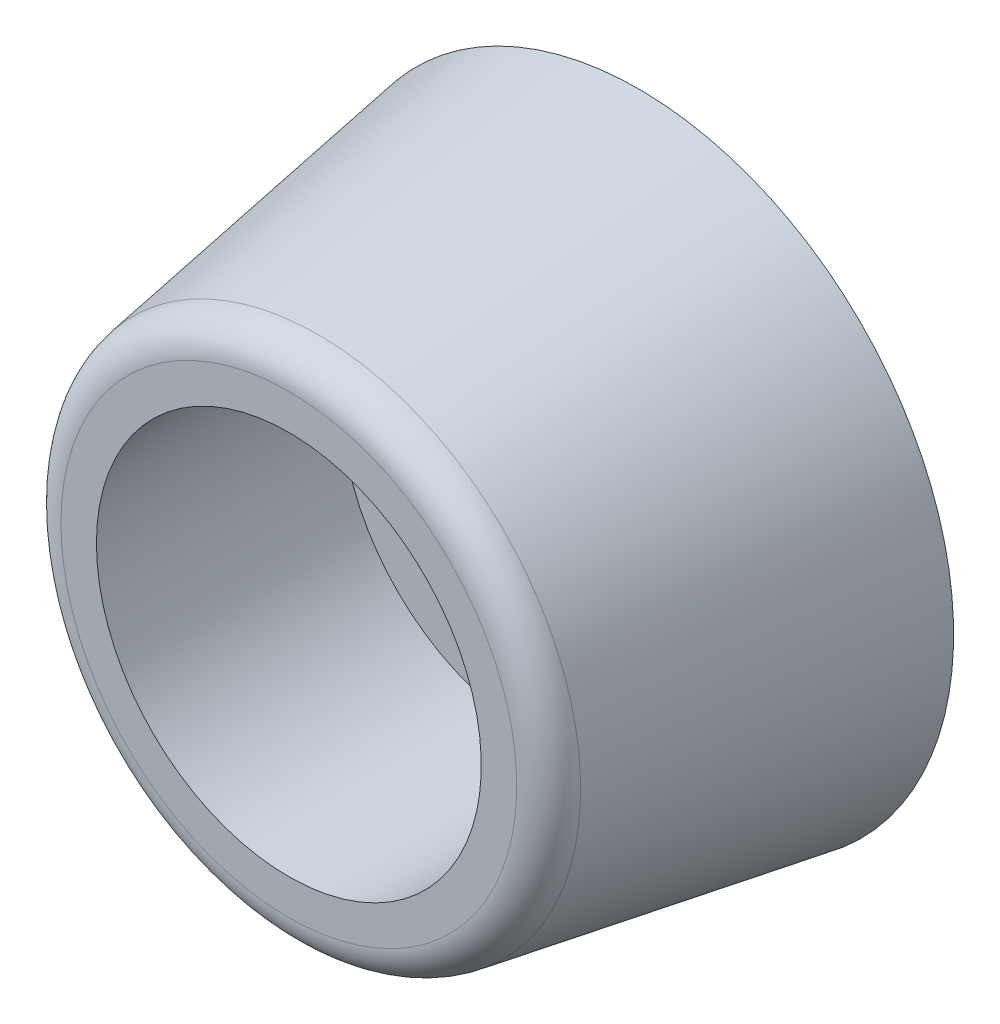
ISO-10303-21;
HEADER;
FILE_DESCRIPTION(('STEP AP214'),'2;1');
FILE_NAME('part.step','',(''),(''),'','','');
FILE_SCHEMA(('AUTOMOTIVE_DESIGN { 1 0 10303 214 1 1 1 1 }'));
ENDSEC;
DATA;
#1=APPLICATION_CONTEXT('core data for automotive mechanical design processes');
#2=APPLICATION_PROTOCOL_DEFINITION('international standard','automotive_design',2000,#1);
#3=PRODUCT_CONTEXT('',#1,'mechanical');
#4=PRODUCT('Part','Part','',(#3));
#5=PRODUCT_RELATED_PRODUCT_CATEGORY('part','',(#4));
#6=PRODUCT_DEFINITION_FORMATION('','',#4);
#7=PRODUCT_DEFINITION_CONTEXT('part definition',#1,'design');
#8=PRODUCT_DEFINITION('design','',#6,#7);
#9=PRODUCT_DEFINITION_SHAPE('','',#8);
#10=(LENGTH_UNIT() NAMED_UNIT(*) SI_UNIT(.MILLI.,.METRE.));
#11=(NAMED_UNIT(*) PLANE_ANGLE_UNIT() SI_UNIT($,.RADIAN.));
#12=(NAMED_UNIT(*) SI_UNIT($,.STERADIAN.) SOLID_ANGLE_UNIT());
#13=UNCERTAINTY_MEASURE_WITH_UNIT(LENGTH_MEASURE(1.E-05),#10,'distance_accuracy_value','');
#14=(GEOMETRIC_REPRESENTATION_CONTEXT(3) GLOBAL_UNCERTAINTY_ASSIGNED_CONTEXT((#13)) GLOBAL_UNIT_ASSIGNED_CONTEXT((#10,
#11,#12)) REPRESENTATION_CONTEXT('',''));
#15=CARTESIAN_POINT('',(0.,0.,0.));
#16=DIRECTION('',(0.,0.,1.));
#17=DIRECTION('',(1.,0.,0.));
#18=AXIS2_PLACEMENT_3D('',#15,#16,#17);
#19=CARTESIAN_POINT('',(0.,0.,0.));
#20=DIRECTION('',(0.,0.,-1.));
#21=DIRECTION('',(-1.,0.,0.));
#22=AXIS2_PLACEMENT_3D('',#19,#20,#21);
#23=CYLINDRICAL_SURFACE('',#22,2.15);
#24=CARTESIAN_POINT('',(0.,0.,0.));
#25=DIRECTION('',(0.,0.,-1.));
#26=DIRECTION('',(-1.,0.,0.));
#27=AXIS2_PLACEMENT_3D('',#24,#25,#26);
#28=CIRCLE('',#27,2.15);
#29=CARTESIAN_POINT('',(-2.15,0.,0.));
#30=VERTEX_POINT('',#29);
#31=EDGE_CURVE('E10',#30,#30,#28,.T.);
#32=ORIENTED_EDGE('',*,*,#31,.T.);
#33=EDGE_LOOP('',(#32));
#34=FACE_BOUND('',#33,.T.);
#35=CARTESIAN_POINT('',(0.,0.,3.));
#36=DIRECTION('',(0.,0.,-1.));
#37=DIRECTION('',(-1.,0.,0.));
#38=AXIS2_PLACEMENT_3D('',#35,#36,#37);
#39=CIRCLE('',#38,2.15);
#40=CARTESIAN_POINT('',(-2.15,0.,3.));
#41=VERTEX_POINT('',#40);
#42=EDGE_CURVE('E58',#41,#41,#39,.T.);
#43=ORIENTED_EDGE('',*,*,#42,.F.);
#44=EDGE_LOOP('',(#43));
#45=FACE_BOUND('',#44,.T.);
#46=ADVANCED_FACE('F33',(#34,#45),#23,.F.);
#47=CARTESIAN_POINT('',(-2.15,0.,0.));
#48=DIRECTION('',(0.,0.,-1.));
#49=DIRECTION('',(-1.,0.,0.));
#50=AXIS2_PLACEMENT_3D('',#47,#48,#49);
#51=PLANE('',#50);
#52=CARTESIAN_POINT('',(0.,0.,0.));
#53=DIRECTION('',(0.,0.,-1.));
#54=DIRECTION('',(-1.,0.,0.));
#55=AXIS2_PLACEMENT_3D('',#52,#53,#54);
#56=CIRCLE('',#55,9.);
#57=CARTESIAN_POINT('',(-9.,0.,0.));
#58=VERTEX_POINT('',#57);
#59=EDGE_CURVE('E39',#58,#58,#56,.T.);
#60=ORIENTED_EDGE('',*,*,#59,.T.);
#61=EDGE_LOOP('',(#60));
#62=FACE_BOUND('',#61,.T.);
#63=ORIENTED_EDGE('',*,*,#31,.F.);
#64=EDGE_LOOP('',(#63));
#65=FACE_BOUND('',#64,.T.);
#66=ADVANCED_FACE('F66',(#62,#65),#51,.T.);
#67=CARTESIAN_POINT('',(0.,0.,0.));
#68=DIRECTION('',(0.,0.,-1.));
#69=DIRECTION('',(-1.,0.,0.));
#70=AXIS2_PLACEMENT_3D('',#67,#68,#69);
#71=CONICAL_SURFACE('',#70,9.,0.162287386907581);
#72=CARTESIAN_POINT('',(0.,0.,9.16157595862056));
#73=DIRECTION('',(0.,0.,-1.));
#74=DIRECTION('',(-1.,0.,0.));
#75=AXIS2_PLACEMENT_3D('',#72,#73,#74);
#76=CIRCLE('',#75,7.5);
#77=CARTESIAN_POINT('',(-7.5,0.,9.16157595862056));
#78=VERTEX_POINT('',#77);
#79=EDGE_CURVE('E43',#78,#78,#76,.T.);
#80=ORIENTED_EDGE('',*,*,#79,.T.);
#81=EDGE_LOOP('',(#80));
#82=FACE_BOUND('',#81,.T.);
#83=ORIENTED_EDGE('',*,*,#59,.F.);
#84=EDGE_LOOP('',(#83));
#85=FACE_BOUND('',#84,.T.);
#86=ADVANCED_FACE('F70',(#82,#85),#71,.T.);
#87=CARTESIAN_POINT('',(0.,0.,9.));
#88=DIRECTION('',(0.,0.,-1.));
#89=DIRECTION('',(-1.,0.,0.));
#90=AXIS2_PLACEMENT_3D('',#87,#88,#89);
#91=TOROIDAL_SURFACE('',#90,6.51313972134053,1.);
#92=CARTESIAN_POINT('',(0.,0.,10.));
#93=DIRECTION('',(0.,0.,-1.));
#94=DIRECTION('',(-1.,0.,0.));
#95=AXIS2_PLACEMENT_3D('',#92,#93,#94);
#96=CIRCLE('',#95,6.51313972134053);
#97=CARTESIAN_POINT('',(-6.51313972134053,0.,10.));
#98=VERTEX_POINT('',#97);
#99=EDGE_CURVE('E47',#98,#98,#96,.T.);
#100=ORIENTED_EDGE('',*,*,#99,.T.);
#101=EDGE_LOOP('',(#100));
#102=FACE_BOUND('',#101,.T.);
#103=ORIENTED_EDGE('',*,*,#79,.F.);
#104=EDGE_LOOP('',(#103));
#105=FACE_BOUND('',#104,.T.);
#106=ADVANCED_FACE('F74',(#102,#105),#91,.T.);
#107=CARTESIAN_POINT('',(-6.51313972134053,0.,10.));
#108=DIRECTION('',(0.,0.,1.));
#109=DIRECTION('',(1.,0.,0.));
#110=AXIS2_PLACEMENT_3D('',#107,#108,#109);
#111=PLANE('',#110);
#112=CARTESIAN_POINT('',(0.,0.,10.));
#113=DIRECTION('',(0.,0.,-1.));
#114=DIRECTION('',(-1.,0.,0.));
#115=AXIS2_PLACEMENT_3D('',#112,#113,#114);
#116=CIRCLE('',#115,5.5);
#117=CARTESIAN_POINT('',(-5.5,0.,10.));
#118=VERTEX_POINT('',#117);
#119=EDGE_CURVE('E52',#118,#118,#116,.T.);
#120=ORIENTED_EDGE('',*,*,#119,.T.);
#121=EDGE_LOOP('',(#120));
#122=FACE_BOUND('',#121,.T.);
#123=ORIENTED_EDGE('',*,*,#99,.F.);
#124=EDGE_LOOP('',(#123));
#125=FACE_BOUND('',#124,.T.);
#126=ADVANCED_FACE('F81',(#122,#125),#111,.T.);
#127=CARTESIAN_POINT('',(0.,0.,0.));
#128=DIRECTION('',(0.,0.,-1.));
#129=DIRECTION('',(-1.,0.,0.));
#130=AXIS2_PLACEMENT_3D('',#127,#128,#129);
#131=CYLINDRICAL_SURFACE('',#130,5.5);
#132=CARTESIAN_POINT('',(0.,0.,3.));
#133=DIRECTION('',(0.,0.,-1.));
#134=DIRECTION('',(-1.,0.,0.));
#135=AXIS2_PLACEMENT_3D('',#132,#133,#134);
#136=CIRCLE('',#135,5.5);
#137=CARTESIAN_POINT('',(-5.5,0.,3.));
#138=VERTEX_POINT('',#137);
#139=EDGE_CURVE('E55',#138,#138,#136,.T.);
#140=ORIENTED_EDGE('',*,*,#139,.T.);
#141=EDGE_LOOP('',(#140));
#142=FACE_BOUND('',#141,.T.);
#143=ORIENTED_EDGE('',*,*,#119,.F.);
#144=EDGE_LOOP('',(#143));
#145=FACE_BOUND('',#144,.T.);
#146=ADVANCED_FACE('F85',(#142,#145),#131,.F.);
#147=CARTESIAN_POINT('',(-5.5,0.,3.));
#148=DIRECTION('',(0.,0.,1.));
#149=DIRECTION('',(1.,0.,0.));
#150=AXIS2_PLACEMENT_3D('',#147,#148,#149);
#151=PLANE('',#150);
#152=ORIENTED_EDGE('',*,*,#42,.T.);
#153=EDGE_LOOP('',(#152));
#154=FACE_BOUND('',#153,.T.);
#155=ORIENTED_EDGE('',*,*,#139,.F.);
#156=EDGE_LOOP('',(#155));
#157=FACE_BOUND('',#156,.T.);
#158=ADVANCED_FACE('F62',(#154,#157),#151,.T.);
#159=CLOSED_SHELL('',(#46,#66,#86,#106,#126,#146,#158));
#160=MANIFOLD_SOLID_BREP('B2',#159);
#161=ADVANCED_BREP_SHAPE_REPRESENTATION('',(#18,#160),#14);
#162=SHAPE_DEFINITION_REPRESENTATION(#9,#161);
ENDSEC;
END-ISO-10303-21;
